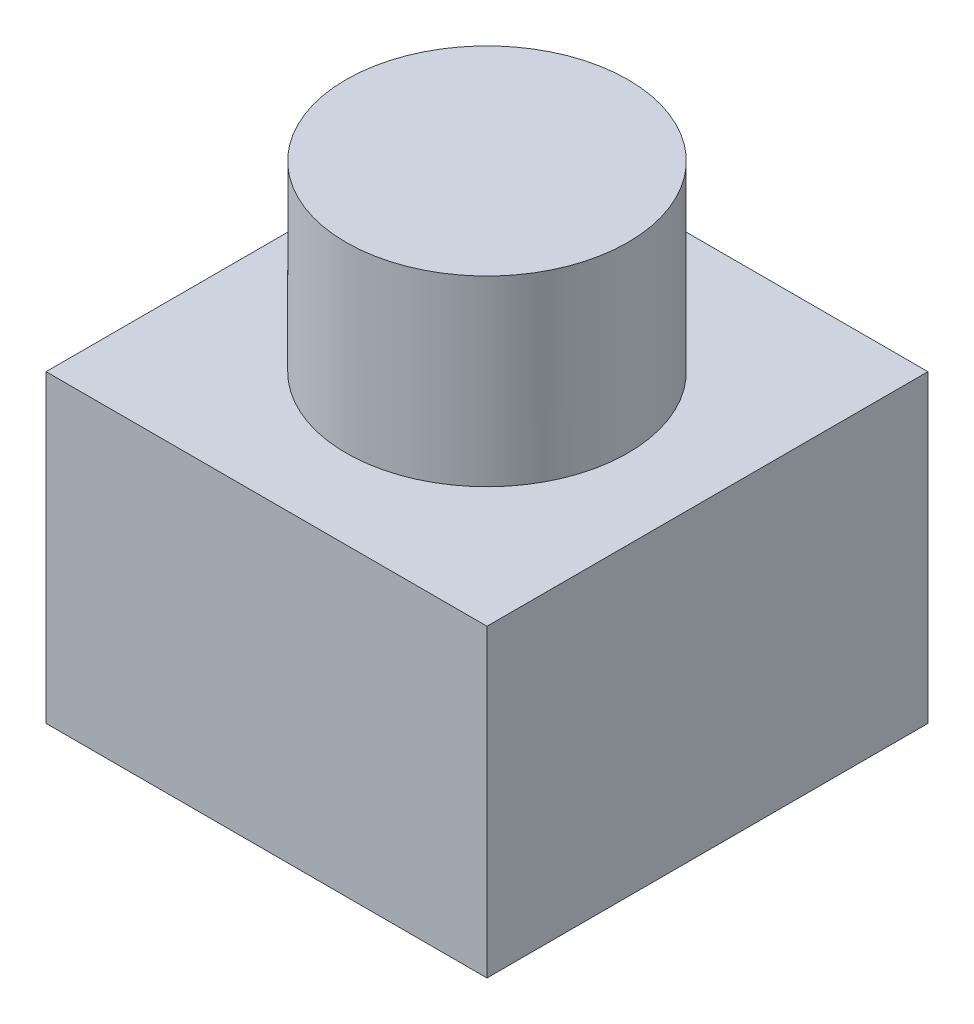
ISO-10303-21;
HEADER;
FILE_DESCRIPTION(('STEP AP214'),'2;1');
FILE_NAME('part.step','',(''),(''),'','','');
FILE_SCHEMA(('AUTOMOTIVE_DESIGN { 1 0 10303 214 1 1 1 1 }'));
ENDSEC;
DATA;
#1=APPLICATION_CONTEXT('core data for automotive mechanical design processes');
#2=APPLICATION_PROTOCOL_DEFINITION('international standard','automotive_design',2000,#1);
#3=PRODUCT_CONTEXT('',#1,'mechanical');
#4=PRODUCT('Part','Part','',(#3));
#5=PRODUCT_RELATED_PRODUCT_CATEGORY('part','',(#4));
#6=PRODUCT_DEFINITION_FORMATION('','',#4);
#7=PRODUCT_DEFINITION_CONTEXT('part definition',#1,'design');
#8=PRODUCT_DEFINITION('design','',#6,#7);
#9=PRODUCT_DEFINITION_SHAPE('','',#8);
#10=(LENGTH_UNIT() NAMED_UNIT(*) SI_UNIT(.MILLI.,.METRE.));
#11=(NAMED_UNIT(*) PLANE_ANGLE_UNIT() SI_UNIT($,.RADIAN.));
#12=(NAMED_UNIT(*) SI_UNIT($,.STERADIAN.) SOLID_ANGLE_UNIT());
#13=UNCERTAINTY_MEASURE_WITH_UNIT(LENGTH_MEASURE(1.E-05),#10,'distance_accuracy_value','');
#14=(GEOMETRIC_REPRESENTATION_CONTEXT(3) GLOBAL_UNCERTAINTY_ASSIGNED_CONTEXT((#13)) GLOBAL_UNIT_ASSIGNED_CONTEXT((#10,
#11,#12)) REPRESENTATION_CONTEXT('',''));
#15=CARTESIAN_POINT('',(0.,0.,0.));
#16=DIRECTION('',(0.,0.,1.));
#17=DIRECTION('',(1.,0.,0.));
#18=AXIS2_PLACEMENT_3D('',#15,#16,#17);
#19=CARTESIAN_POINT('',(-27.5,38.,-27.5));
#20=DIRECTION('',(1.,0.,0.));
#21=DIRECTION('',(0.,0.,-1.));
#22=AXIS2_PLACEMENT_3D('',#19,#20,#21);
#23=PLANE('',#22);
#24=DIRECTION('',(0.,0.,1.));
#25=VECTOR('',#24,1.);
#26=CARTESIAN_POINT('',(-27.5,0.,-27.5));
#27=LINE('',#26,#25);
#28=CARTESIAN_POINT('',(-27.5,0.,-27.5));
#29=VERTEX_POINT('',#28);
#30=CARTESIAN_POINT('',(-27.5,0.,27.5));
#31=VERTEX_POINT('',#30);
#32=EDGE_CURVE('E99',#29,#31,#27,.T.);
#33=ORIENTED_EDGE('',*,*,#32,.T.);
#34=DIRECTION('',(0.,-1.,0.));
#35=VECTOR('',#34,1.);
#36=CARTESIAN_POINT('',(-27.5,38.,27.5));
#37=LINE('',#36,#35);
#38=CARTESIAN_POINT('',(-27.5,38.,27.5));
#39=VERTEX_POINT('',#38);
#40=EDGE_CURVE('E41',#39,#31,#37,.T.);
#41=ORIENTED_EDGE('',*,*,#40,.F.);
#42=DIRECTION('',(0.,0.,1.));
#43=VECTOR('',#42,1.);
#44=CARTESIAN_POINT('',(-27.5,38.,-27.5));
#45=LINE('',#44,#43);
#46=CARTESIAN_POINT('',(-27.5,38.,-27.5));
#47=VERTEX_POINT('',#46);
#48=EDGE_CURVE('E85',#47,#39,#45,.T.);
#49=ORIENTED_EDGE('',*,*,#48,.F.);
#50=DIRECTION('',(0.,-1.,0.));
#51=VECTOR('',#50,1.);
#52=CARTESIAN_POINT('',(-27.5,38.,-27.5));
#53=LINE('',#52,#51);
#54=EDGE_CURVE('E95',#47,#29,#53,.T.);
#55=ORIENTED_EDGE('',*,*,#54,.T.);
#56=EDGE_LOOP('',(#33,#41,#49,#55));
#57=FACE_BOUND('',#56,.T.);
#58=ADVANCED_FACE('F33',(#57),#23,.F.);
#59=CARTESIAN_POINT('',(27.5,38.,27.5));
#60=DIRECTION('',(0.,0.,-1.));
#61=DIRECTION('',(-1.,0.,0.));
#62=AXIS2_PLACEMENT_3D('',#59,#60,#61);
#63=PLANE('',#62);
#64=DIRECTION('',(1.,0.,0.));
#65=VECTOR('',#64,1.);
#66=CARTESIAN_POINT('',(27.5,0.,27.5));
#67=LINE('',#66,#65);
#68=CARTESIAN_POINT('',(27.5,0.,27.5));
#69=VERTEX_POINT('',#68);
#70=EDGE_CURVE('E90',#31,#69,#67,.T.);
#71=ORIENTED_EDGE('',*,*,#70,.T.);
#72=DIRECTION('',(0.,-1.,0.));
#73=VECTOR('',#72,1.);
#74=CARTESIAN_POINT('',(27.5,38.,27.5));
#75=LINE('',#74,#73);
#76=CARTESIAN_POINT('',(27.5,38.,27.5));
#77=VERTEX_POINT('',#76);
#78=EDGE_CURVE('E88',#77,#69,#75,.T.);
#79=ORIENTED_EDGE('',*,*,#78,.F.);
#80=DIRECTION('',(1.,0.,0.));
#81=VECTOR('',#80,1.);
#82=CARTESIAN_POINT('',(27.5,38.,27.5));
#83=LINE('',#82,#81);
#84=EDGE_CURVE('E80',#39,#77,#83,.T.);
#85=ORIENTED_EDGE('',*,*,#84,.F.);
#86=ORIENTED_EDGE('',*,*,#40,.T.);
#87=EDGE_LOOP('',(#71,#79,#85,#86));
#88=FACE_BOUND('',#87,.T.);
#89=ADVANCED_FACE('F89',(#88),#63,.F.);
#90=CARTESIAN_POINT('',(27.5,38.,-27.5));
#91=DIRECTION('',(-1.,0.,0.));
#92=DIRECTION('',(0.,0.,1.));
#93=AXIS2_PLACEMENT_3D('',#90,#91,#92);
#94=PLANE('',#93);
#95=DIRECTION('',(0.,0.,-1.));
#96=VECTOR('',#95,1.);
#97=CARTESIAN_POINT('',(27.5,0.,-27.5));
#98=LINE('',#97,#96);
#99=CARTESIAN_POINT('',(27.5,0.,-27.5));
#100=VERTEX_POINT('',#99);
#101=EDGE_CURVE('E66',#69,#100,#98,.T.);
#102=ORIENTED_EDGE('',*,*,#101,.T.);
#103=DIRECTION('',(0.,-1.,0.));
#104=VECTOR('',#103,1.);
#105=CARTESIAN_POINT('',(27.5,38.,-27.5));
#106=LINE('',#105,#104);
#107=CARTESIAN_POINT('',(27.5,38.,-27.5));
#108=VERTEX_POINT('',#107);
#109=EDGE_CURVE('E91',#108,#100,#106,.T.);
#110=ORIENTED_EDGE('',*,*,#109,.F.);
#111=DIRECTION('',(0.,0.,-1.));
#112=VECTOR('',#111,1.);
#113=CARTESIAN_POINT('',(27.5,38.,-27.5));
#114=LINE('',#113,#112);
#115=EDGE_CURVE('E83',#77,#108,#114,.T.);
#116=ORIENTED_EDGE('',*,*,#115,.F.);
#117=ORIENTED_EDGE('',*,*,#78,.T.);
#118=EDGE_LOOP('',(#102,#110,#116,#117));
#119=FACE_BOUND('',#118,.T.);
#120=ADVANCED_FACE('F93',(#119),#94,.F.);
#121=CARTESIAN_POINT('',(27.5,38.,-27.5));
#122=DIRECTION('',(0.,0.,1.));
#123=DIRECTION('',(1.,0.,0.));
#124=AXIS2_PLACEMENT_3D('',#121,#122,#123);
#125=PLANE('',#124);
#126=DIRECTION('',(-1.,0.,0.));
#127=VECTOR('',#126,1.);
#128=CARTESIAN_POINT('',(27.5,0.,-27.5));
#129=LINE('',#128,#127);
#130=EDGE_CURVE('E72',#100,#29,#129,.T.);
#131=ORIENTED_EDGE('',*,*,#130,.T.);
#132=ORIENTED_EDGE('',*,*,#54,.F.);
#133=DIRECTION('',(-1.,0.,0.));
#134=VECTOR('',#133,1.);
#135=CARTESIAN_POINT('',(27.5,38.,-27.5));
#136=LINE('',#135,#134);
#137=EDGE_CURVE('E49',#108,#47,#136,.T.);
#138=ORIENTED_EDGE('',*,*,#137,.F.);
#139=ORIENTED_EDGE('',*,*,#109,.T.);
#140=EDGE_LOOP('',(#131,#132,#138,#139));
#141=FACE_BOUND('',#140,.T.);
#142=ADVANCED_FACE('F121',(#141),#125,.F.);
#143=CARTESIAN_POINT('',(0.,38.,0.));
#144=DIRECTION('',(0.,-1.,0.));
#145=DIRECTION('',(0.,0.,-1.));
#146=AXIS2_PLACEMENT_3D('',#143,#144,#145);
#147=PLANE('',#146);
#148=CARTESIAN_POINT('',(0.,38.,0.));
#149=DIRECTION('',(0.,-1.,0.));
#150=DIRECTION('',(0.,0.,-1.));
#151=AXIS2_PLACEMENT_3D('',#148,#149,#150);
#152=CIRCLE('',#151,17.5838438047783);
#153=CARTESIAN_POINT('',(0.,38.,-17.5838438047783));
#154=VERTEX_POINT('',#153);
#155=EDGE_CURVE('E11',#154,#154,#152,.F.);
#156=ORIENTED_EDGE('',*,*,#155,.F.);
#157=EDGE_LOOP('',(#156));
#158=FACE_BOUND('',#157,.T.);
#159=ORIENTED_EDGE('',*,*,#48,.T.);
#160=ORIENTED_EDGE('',*,*,#84,.T.);
#161=ORIENTED_EDGE('',*,*,#115,.T.);
#162=ORIENTED_EDGE('',*,*,#137,.T.);
#163=EDGE_LOOP('',(#159,#160,#161,#162));
#164=FACE_BOUND('',#163,.T.);
#165=ADVANCED_FACE('F81',(#158,#164),#147,.F.);
#166=CARTESIAN_POINT('',(0.,0.,0.));
#167=DIRECTION('',(0.,-1.,0.));
#168=DIRECTION('',(0.,0.,-1.));
#169=AXIS2_PLACEMENT_3D('',#166,#167,#168);
#170=PLANE('',#169);
#171=ORIENTED_EDGE('',*,*,#32,.F.);
#172=ORIENTED_EDGE('',*,*,#130,.F.);
#173=ORIENTED_EDGE('',*,*,#101,.F.);
#174=ORIENTED_EDGE('',*,*,#70,.F.);
#175=EDGE_LOOP('',(#171,#172,#173,#174));
#176=FACE_BOUND('',#175,.T.);
#177=ADVANCED_FACE('F110',(#176),#170,.T.);
#178=CARTESIAN_POINT('',(0.,60.76,0.));
#179=DIRECTION('',(0.,-1.,0.));
#180=DIRECTION('',(0.,0.,-1.));
#181=AXIS2_PLACEMENT_3D('',#178,#179,#180);
#182=CYLINDRICAL_SURFACE('',#181,17.5838438047783);
#183=CARTESIAN_POINT('',(0.,60.76,0.));
#184=DIRECTION('',(0.,1.,0.));
#185=DIRECTION('',(0.,0.,1.));
#186=AXIS2_PLACEMENT_3D('',#183,#184,#185);
#187=CIRCLE('',#186,17.5838438047783);
#188=CARTESIAN_POINT('',(0.,60.76,17.5838438047783));
#189=VERTEX_POINT('',#188);
#190=EDGE_CURVE('E102',#189,#189,#187,.T.);
#191=ORIENTED_EDGE('',*,*,#190,.F.);
#192=EDGE_LOOP('',(#191));
#193=FACE_BOUND('',#192,.T.);
#194=ORIENTED_EDGE('',*,*,#155,.T.);
#195=EDGE_LOOP('',(#194));
#196=FACE_BOUND('',#195,.T.);
#197=ADVANCED_FACE('F112',(#193,#196),#182,.T.);
#198=CARTESIAN_POINT('',(0.,60.76,0.));
#199=DIRECTION('',(0.,1.,0.));
#200=DIRECTION('',(0.,0.,1.));
#201=AXIS2_PLACEMENT_3D('',#198,#199,#200);
#202=PLANE('',#201);
#203=ORIENTED_EDGE('',*,*,#190,.T.);
#204=EDGE_LOOP('',(#203));
#205=FACE_BOUND('',#204,.T.);
#206=ADVANCED_FACE('F118',(#205),#202,.T.);
#207=CLOSED_SHELL('',(#58,#89,#120,#142,#165,#177,#197,#206));
#208=MANIFOLD_SOLID_BREP('B2',#207);
#209=ADVANCED_BREP_SHAPE_REPRESENTATION('',(#18,#208),#14);
#210=SHAPE_DEFINITION_REPRESENTATION(#9,#209);
ENDSEC;
END-ISO-10303-21;
